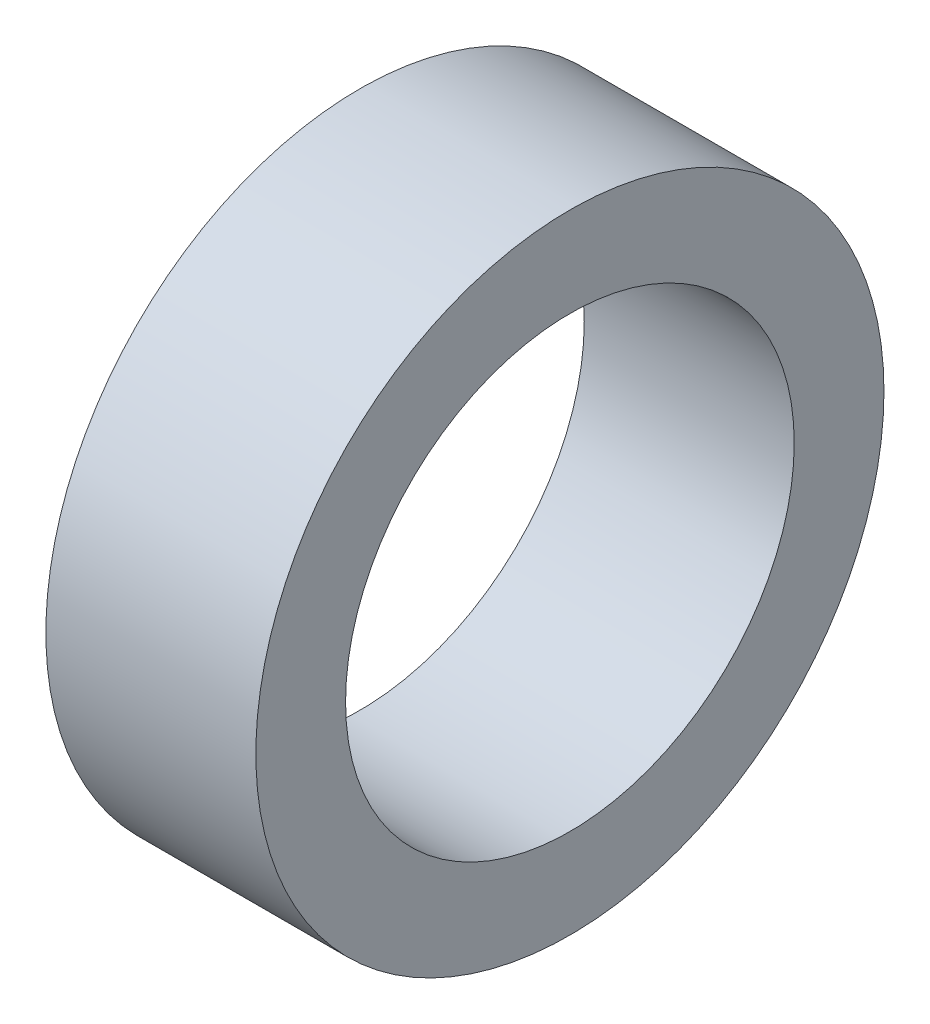
ISO-10303-21;
HEADER;
FILE_DESCRIPTION(('STEP AP214'),'2;1');
FILE_NAME('part.step','',(''),(''),'','','');
FILE_SCHEMA(('AUTOMOTIVE_DESIGN { 1 0 10303 214 1 1 1 1 }'));
ENDSEC;
DATA;
#1=APPLICATION_CONTEXT('core data for automotive mechanical design processes');
#2=APPLICATION_PROTOCOL_DEFINITION('international standard','automotive_design',2000,#1);
#3=PRODUCT_CONTEXT('',#1,'mechanical');
#4=PRODUCT('Part','Part','',(#3));
#5=PRODUCT_RELATED_PRODUCT_CATEGORY('part','',(#4));
#6=PRODUCT_DEFINITION_FORMATION('','',#4);
#7=PRODUCT_DEFINITION_CONTEXT('part definition',#1,'design');
#8=PRODUCT_DEFINITION('design','',#6,#7);
#9=PRODUCT_DEFINITION_SHAPE('','',#8);
#10=(LENGTH_UNIT() NAMED_UNIT(*) SI_UNIT(.MILLI.,.METRE.));
#11=(NAMED_UNIT(*) PLANE_ANGLE_UNIT() SI_UNIT($,.RADIAN.));
#12=(NAMED_UNIT(*) SI_UNIT($,.STERADIAN.) SOLID_ANGLE_UNIT());
#13=UNCERTAINTY_MEASURE_WITH_UNIT(LENGTH_MEASURE(1.E-05),#10,'distance_accuracy_value','');
#14=(GEOMETRIC_REPRESENTATION_CONTEXT(3) GLOBAL_UNCERTAINTY_ASSIGNED_CONTEXT((#13)) GLOBAL_UNIT_ASSIGNED_CONTEXT((#10,
#11,#12)) REPRESENTATION_CONTEXT('',''));
#15=CARTESIAN_POINT('',(0.,0.,0.));
#16=DIRECTION('',(0.,0.,1.));
#17=DIRECTION('',(1.,0.,0.));
#18=AXIS2_PLACEMENT_3D('',#15,#16,#17);
#19=CARTESIAN_POINT('',(2.9718,0.,0.));
#20=DIRECTION('',(1.,0.,0.));
#21=DIRECTION('',(0.,0.,-1.));
#22=AXIS2_PLACEMENT_3D('',#19,#20,#21);
#23=PLANE('',#22);
#24=CARTESIAN_POINT('',(2.9718,0.,0.));
#25=DIRECTION('',(1.,0.,0.));
#26=DIRECTION('',(0.,0.,-1.));
#27=AXIS2_PLACEMENT_3D('',#24,#25,#26);
#28=CIRCLE('',#27,4.445);
#29=CARTESIAN_POINT('',(2.9718,0.,-4.445));
#30=VERTEX_POINT('',#29);
#31=EDGE_CURVE('E10',#30,#30,#28,.T.);
#32=ORIENTED_EDGE('',*,*,#31,.T.);
#33=EDGE_LOOP('',(#32));
#34=FACE_BOUND('',#33,.T.);
#35=CARTESIAN_POINT('',(2.9718,0.,0.));
#36=DIRECTION('',(1.,0.,0.));
#37=DIRECTION('',(0.,0.,-1.));
#38=AXIS2_PLACEMENT_3D('',#35,#36,#37);
#39=CIRCLE('',#38,3.175);
#40=CARTESIAN_POINT('',(2.9718,0.,-3.175));
#41=VERTEX_POINT('',#40);
#42=EDGE_CURVE('E50',#41,#41,#39,.T.);
#43=ORIENTED_EDGE('',*,*,#42,.F.);
#44=EDGE_LOOP('',(#43));
#45=FACE_BOUND('',#44,.T.);
#46=ADVANCED_FACE('F39',(#34,#45),#23,.T.);
#47=CARTESIAN_POINT('',(0.,0.,0.));
#48=DIRECTION('',(1.,0.,0.));
#49=DIRECTION('',(0.,0.,-1.));
#50=AXIS2_PLACEMENT_3D('',#47,#48,#49);
#51=PLANE('',#50);
#52=CARTESIAN_POINT('',(0.,0.,0.));
#53=DIRECTION('',(1.,0.,0.));
#54=DIRECTION('',(0.,0.,-1.));
#55=AXIS2_PLACEMENT_3D('',#52,#53,#54);
#56=CIRCLE('',#55,4.445);
#57=CARTESIAN_POINT('',(0.,0.,-4.445));
#58=VERTEX_POINT('',#57);
#59=EDGE_CURVE('E43',#58,#58,#56,.T.);
#60=ORIENTED_EDGE('',*,*,#59,.F.);
#61=EDGE_LOOP('',(#60));
#62=FACE_BOUND('',#61,.T.);
#63=CARTESIAN_POINT('',(0.,0.,0.));
#64=DIRECTION('',(1.,0.,0.));
#65=DIRECTION('',(0.,0.,-1.));
#66=AXIS2_PLACEMENT_3D('',#63,#64,#65);
#67=CIRCLE('',#66,3.175);
#68=CARTESIAN_POINT('',(0.,0.,-3.175));
#69=VERTEX_POINT('',#68);
#70=EDGE_CURVE('E52',#69,#69,#67,.T.);
#71=ORIENTED_EDGE('',*,*,#70,.T.);
#72=EDGE_LOOP('',(#71));
#73=FACE_BOUND('',#72,.T.);
#74=ADVANCED_FACE('F62',(#62,#73),#51,.F.);
#75=CARTESIAN_POINT('',(2.9718,0.,0.));
#76=DIRECTION('',(-1.,0.,0.));
#77=DIRECTION('',(0.,0.,1.));
#78=AXIS2_PLACEMENT_3D('',#75,#76,#77);
#79=CYLINDRICAL_SURFACE('',#78,4.445);
#80=ORIENTED_EDGE('',*,*,#31,.F.);
#81=EDGE_LOOP('',(#80));
#82=FACE_BOUND('',#81,.T.);
#83=ORIENTED_EDGE('',*,*,#59,.T.);
#84=EDGE_LOOP('',(#83));
#85=FACE_BOUND('',#84,.T.);
#86=ADVANCED_FACE('F41',(#82,#85),#79,.T.);
#87=CARTESIAN_POINT('',(2.9718,0.,0.));
#88=DIRECTION('',(-1.,0.,0.));
#89=DIRECTION('',(0.,0.,1.));
#90=AXIS2_PLACEMENT_3D('',#87,#88,#89);
#91=CYLINDRICAL_SURFACE('',#90,3.175);
#92=ORIENTED_EDGE('',*,*,#42,.T.);
#93=EDGE_LOOP('',(#92));
#94=FACE_BOUND('',#93,.T.);
#95=ORIENTED_EDGE('',*,*,#70,.F.);
#96=EDGE_LOOP('',(#95));
#97=FACE_BOUND('',#96,.T.);
#98=ADVANCED_FACE('F58',(#94,#97),#91,.F.);
#99=CLOSED_SHELL('',(#46,#74,#86,#98));
#100=MANIFOLD_SOLID_BREP('B2',#99);
#101=ADVANCED_BREP_SHAPE_REPRESENTATION('',(#18,#100),#14);
#102=SHAPE_DEFINITION_REPRESENTATION(#9,#101);
ENDSEC;
END-ISO-10303-21;
